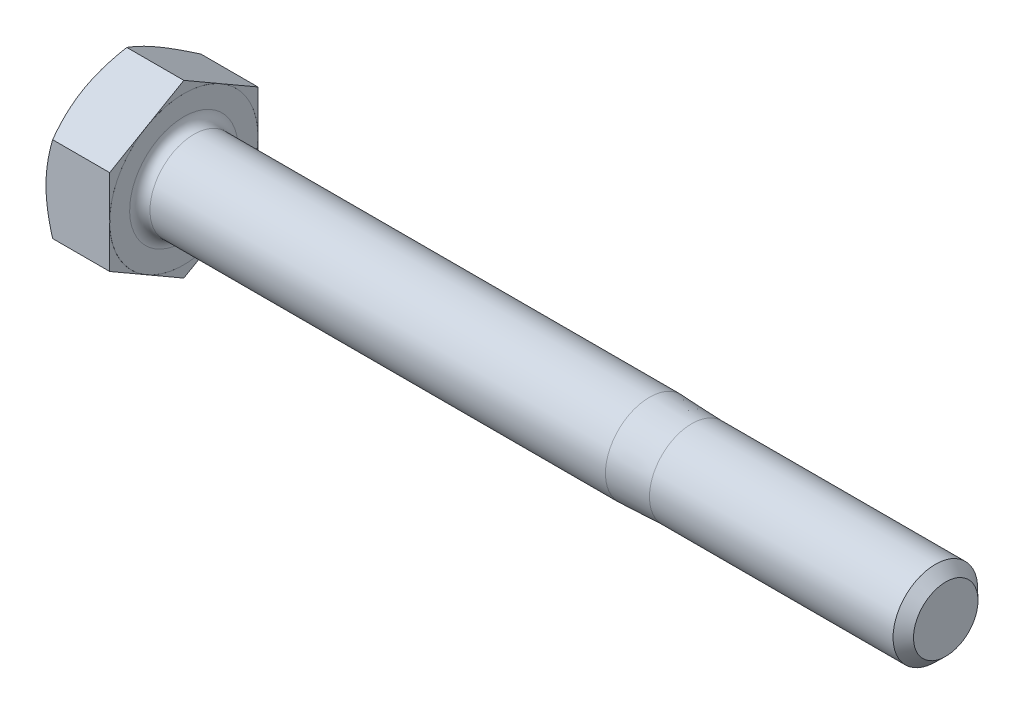
ISO-10303-21;
HEADER;
FILE_DESCRIPTION(('STEP AP214'),'2;1');
FILE_NAME('part.step','',(''),(''),'','','');
FILE_SCHEMA(('AUTOMOTIVE_DESIGN { 1 0 10303 214 1 1 1 1 }'));
ENDSEC;
DATA;
#1=APPLICATION_CONTEXT('core data for automotive mechanical design processes');
#2=APPLICATION_PROTOCOL_DEFINITION('international standard','automotive_design',2000,#1);
#3=PRODUCT_CONTEXT('',#1,'mechanical');
#4=PRODUCT('Part','Part','',(#3));
#5=PRODUCT_RELATED_PRODUCT_CATEGORY('part','',(#4));
#6=PRODUCT_DEFINITION_FORMATION('','',#4);
#7=PRODUCT_DEFINITION_CONTEXT('part definition',#1,'design');
#8=PRODUCT_DEFINITION('design','',#6,#7);
#9=PRODUCT_DEFINITION_SHAPE('','',#8);
#10=(LENGTH_UNIT() NAMED_UNIT(*) SI_UNIT(.MILLI.,.METRE.));
#11=(NAMED_UNIT(*) PLANE_ANGLE_UNIT() SI_UNIT($,.RADIAN.));
#12=(NAMED_UNIT(*) SI_UNIT($,.STERADIAN.) SOLID_ANGLE_UNIT());
#13=UNCERTAINTY_MEASURE_WITH_UNIT(LENGTH_MEASURE(1.E-05),#10,'distance_accuracy_value','');
#14=(GEOMETRIC_REPRESENTATION_CONTEXT(3) GLOBAL_UNCERTAINTY_ASSIGNED_CONTEXT((#13)) GLOBAL_UNIT_ASSIGNED_CONTEXT((#10,
#11,#12)) REPRESENTATION_CONTEXT('',''));
#15=CARTESIAN_POINT('',(0.,0.,0.));
#16=DIRECTION('',(0.,0.,1.));
#17=DIRECTION('',(1.,0.,0.));
#18=AXIS2_PLACEMENT_3D('',#15,#16,#17);
#19=CARTESIAN_POINT('',(-4.77529999999999,3.21156860739421,-5.5626));
#20=DIRECTION('',(0.,-0.866025403784439,0.499999999999999));
#21=DIRECTION('',(0.,-0.499999999999999,-0.866025403784439));
#22=AXIS2_PLACEMENT_3D('',#19,#20,#21);
#23=PLANE('',#22);
#24=CARTESIAN_POINT('',(-4.27840193892987,6.42325268484225,0.000200000000006919));
#25=CARTESIAN_POINT('',(-4.31915379774488,6.3526585812079,-0.122072574209484));
#26=CARTESIAN_POINT('',(-4.35805622469129,6.28180126837449,-0.244801040124756));
#27=CARTESIAN_POINT('',(-4.43165283843947,6.13951120287092,-0.491254662989237));
#28=CARTESIAN_POINT('',(-4.46634520986097,6.06807821602764,-0.614980225538191));
#29=CARTESIAN_POINT('',(-4.56342629893316,5.85263550648139,-0.988137944592613));
#30=CARTESIAN_POINT('',(-4.61864515807664,5.70777535201368,-1.23904309212295));
#31=CARTESIAN_POINT('',(-4.68339621381849,5.49099476252075,-1.61451808721945));
#32=CARTESIAN_POINT('',(-4.70184200165708,5.41972205873199,-1.73796603137439));
#33=CARTESIAN_POINT('',(-4.73277310833255,5.27685459691414,-1.98541973399131));
#34=CARTESIAN_POINT('',(-4.74525895381101,5.20525986790488,-2.10942544218947));
#35=CARTESIAN_POINT('',(-4.76395197006054,5.06194605565757,-2.3576522464282));
#36=CARTESIAN_POINT('',(-4.77016626659417,4.9902272065059,-2.48187293701927));
#37=CARTESIAN_POINT('',(-4.77618959935911,4.84672720555795,-2.73042222954729));
#38=CARTESIAN_POINT('',(-4.77599883344831,4.77494605575469,-2.85475082803224));
#39=CARTESIAN_POINT('',(-4.76667189863659,4.57828637012705,-3.19537539533984));
#40=CARTESIAN_POINT('',(-4.75101260446494,4.4534722013835,-3.41155987710815));
#41=CARTESIAN_POINT('',(-4.70135567661841,4.20467287416473,-3.84249295274001));
#42=CARTESIAN_POINT('',(-4.66734106857655,4.08068859075411,-4.05724003094722));
#43=CARTESIAN_POINT('',(-4.58231395859033,3.83138850679899,-4.48904044268869));
#44=CARTESIAN_POINT('',(-4.53094118606261,3.70610416511176,-4.70603928788378));
#45=CARTESIAN_POINT('',(-4.41434554300041,3.45740388365365,-5.13680081122591));
#46=CARTESIAN_POINT('',(-4.34915006238295,3.33398475856357,-5.35056900650763));
#47=CARTESIAN_POINT('',(-4.27840193892987,3.21145313734037,-5.56279999999999));
#48=B_SPLINE_CURVE_WITH_KNOTS('',3,(#24,#25,#26,#27,#28,#29,#30,#31,#32,#33,#34,#35,#36,#37,#38,
#39,#40,#41,#42,#43,#44,#45,#46,#47),.UNSPECIFIED.,.F.,.F.,(4,2,2,2,2,2,2,2,2,2,2,4),(0.,
0.44082011856227,0.881829648847399,1.76568130465016,2.19678242164486,2.62784543796583,
3.05841812523867,3.48897751176352,4.23854798324166,4.98881282275669,5.75571809391027,
6.52111769989992),.UNSPECIFIED.);
#49=CARTESIAN_POINT('',(-4.27846860739423,6.4231372147884,0.));
#50=VERTEX_POINT('',#49);
#51=CARTESIAN_POINT('',(-4.77530000000001,4.81735291109132,-2.7813));
#52=VERTEX_POINT('',#51);
#53=EDGE_CURVE('E226',#50,#52,#48,.T.);
#54=ORIENTED_EDGE('',*,*,#53,.F.);
#55=DIRECTION('',(1.,0.,0.));
#56=VECTOR('',#55,1.);
#57=CARTESIAN_POINT('',(-4.77529999999999,6.42313721478842,0.));
#58=LINE('',#57,#56);
#59=CARTESIAN_POINT('',(-9.99999999944363E-05,6.42313721478842,0.));
#60=VERTEX_POINT('',#59);
#61=EDGE_CURVE('E149',#50,#60,#58,.T.);
#62=ORIENTED_EDGE('',*,*,#61,.T.);
#63=DIRECTION('',(0.,-0.499999999999999,-0.866025403784439));
#64=VECTOR('',#63,1.);
#65=CARTESIAN_POINT('',(-9.99999999940308E-05,3.21156860739421,-5.5626));
#66=LINE('',#65,#64);
#67=CARTESIAN_POINT('',(-9.99999999942335E-05,4.81735291109131,-2.78129999999999));
#68=VERTEX_POINT('',#67);
#69=EDGE_CURVE('E233',#60,#68,#66,.T.);
#70=ORIENTED_EDGE('',*,*,#69,.T.);
#71=CARTESIAN_POINT('',(-9.99999999940308E-05,3.21156860739421,-5.5626));
#72=VERTEX_POINT('',#71);
#73=EDGE_CURVE('E312',#68,#72,#66,.T.);
#74=ORIENTED_EDGE('',*,*,#73,.T.);
#75=DIRECTION('',(1.,0.,0.));
#76=VECTOR('',#75,1.);
#77=CARTESIAN_POINT('',(-4.77529999999999,3.21156860739421,-5.5626));
#78=LINE('',#77,#76);
#79=CARTESIAN_POINT('',(-4.27846860739423,3.21156860739418,-5.5626));
#80=VERTEX_POINT('',#79);
#81=EDGE_CURVE('E160',#80,#72,#78,.T.);
#82=ORIENTED_EDGE('',*,*,#81,.F.);
#83=EDGE_CURVE('E219',#52,#80,#48,.T.);
#84=ORIENTED_EDGE('',*,*,#83,.F.);
#85=EDGE_LOOP('',(#54,#62,#70,#74,#82,#84));
#86=FACE_BOUND('',#85,.T.);
#87=ADVANCED_FACE('F36',(#86),#23,.F.);
#88=CARTESIAN_POINT('',(-4.77529999999999,-3.21156860739421,-5.5626));
#89=DIRECTION('',(0.,0.,1.));
#90=DIRECTION('',(0.,-1.,0.));
#91=AXIS2_PLACEMENT_3D('',#88,#89,#90);
#92=PLANE('',#91);
#93=CARTESIAN_POINT('',(-2.11344638926698,-8.51755521832246,-5.5626));
#94=CARTESIAN_POINT('',(-2.23147166166824,-8.27332555558046,-5.5626));
#95=CARTESIAN_POINT('',(-2.34832366508809,-8.02851845168018,-5.5626));
#96=CARTESIAN_POINT('',(-2.57901068864596,-7.53743714363392,-5.5626));
#97=CARTESIAN_POINT('',(-2.69284518642687,-7.29116269439858,-5.5626));
#98=CARTESIAN_POINT('',(-2.91742643995797,-6.79550412265191,-5.5626));
#99=CARTESIAN_POINT('',(-3.0281517979358,-6.54611026975771,-5.5626));
#100=CARTESIAN_POINT('',(-3.24484658870404,-6.0452727518282,-5.5626));
#101=CARTESIAN_POINT('',(-3.35081626939904,-5.79382919444944,-5.5626));
#102=CARTESIAN_POINT('',(-3.55799319026707,-5.28537094644158,-5.5626));
#103=CARTESIAN_POINT('',(-3.65912599046174,-5.02832575770978,-5.5626));
#104=CARTESIAN_POINT('',(-3.85347083747971,-4.51120331357714,-5.5626));
#105=CARTESIAN_POINT('',(-3.94668200306209,-4.25112572448762,-5.5626));
#106=CARTESIAN_POINT('',(-4.12267928100746,-3.72805980605447,-5.5626));
#107=CARTESIAN_POINT('',(-4.20548755698438,-3.46507900970405,-5.5626));
#108=CARTESIAN_POINT('',(-4.35798874636038,-2.93537607726828,-5.5626));
#109=CARTESIAN_POINT('',(-4.42768580730656,-2.66865515310524,-5.5626));
#110=CARTESIAN_POINT('',(-4.55058455470475,-2.13130259699166,-5.5626));
#111=CARTESIAN_POINT('',(-4.6037818465973,-1.86066994324131,-5.5626));
#112=CARTESIAN_POINT('',(-4.69008594291753,-1.31610382915986,-5.5626));
#113=CARTESIAN_POINT('',(-4.72319272959575,-1.04217036591281,-5.5626));
#114=CARTESIAN_POINT('',(-4.75566271940497,-0.630834239369238,-5.5626));
#115=CARTESIAN_POINT('',(-4.76362266525993,-0.494075453154336,-5.5626));
#116=CARTESIAN_POINT('',(-4.77374754815026,-0.220337235751522,-5.5626));
#117=CARTESIAN_POINT('',(-4.77591256044099,-0.0833578074520731,-5.5626));
#118=CARTESIAN_POINT('',(-4.77438941878322,0.190528860603805,-5.5626));
#119=CARTESIAN_POINT('',(-4.77070290750695,0.327436109830722,-5.5626));
#120=CARTESIAN_POINT('',(-4.75757014707673,0.600976342858242,-5.5626));
#121=CARTESIAN_POINT('',(-4.74812361028946,0.737609312620523,-5.5626));
#122=CARTESIAN_POINT('',(-4.71844421925849,1.06876539599823,-5.5626));
#123=CARTESIAN_POINT('',(-4.69532516171605,1.26303402663545,-5.5626));
#124=CARTESIAN_POINT('',(-4.63872521450843,1.65008267677664,-5.5626));
#125=CARTESIAN_POINT('',(-4.60524149659494,1.84286227522758,-5.5626));
#126=CARTESIAN_POINT('',(-4.52909973226012,2.22677375324305,-5.5626));
#127=CARTESIAN_POINT('',(-4.48643301145079,2.41790389592351,-5.5626));
#128=CARTESIAN_POINT('',(-4.3932270685715,2.79819772693412,-5.5626));
#129=CARTESIAN_POINT('',(-4.34268858812908,2.98736159872479,-5.5626));
#130=CARTESIAN_POINT('',(-4.23362712743804,3.36838194822663,-5.5626));
#131=CARTESIAN_POINT('',(-4.17493879567645,3.56019076914832,-5.5626));
#132=CARTESIAN_POINT('',(-4.05176338973037,3.94178098716688,-5.5626));
#133=CARTESIAN_POINT('',(-3.98728031517193,4.1315636830324,-5.5626));
#134=CARTESIAN_POINT('',(-3.85384738418795,4.50834012187714,-5.5626));
#135=CARTESIAN_POINT('',(-3.78492471276553,4.69534355027224,-5.56259999999999));
#136=CARTESIAN_POINT('',(-3.64303400403259,5.0678995201045,-5.56259999999999));
#137=CARTESIAN_POINT('',(-3.570064331722,5.25345144007258,-5.56259999999999));
#138=CARTESIAN_POINT('',(-3.49547149678627,5.43832927060622,-5.56259999999999));
#139=B_SPLINE_CURVE_WITH_KNOTS('',3,(#93,#94,#95,#96,#97,#98,#99,#100,#101,#102,#103,#104,#105,
#106,#107,#108,#109,#110,#111,#112,#113,#114,#115,#116,#117,#118,#119,#120,#121,#122,#123,#124,
#125,#126,#127,#128,#129,#130,#131,#132,#133,#134,#135,#136,#137,#138),.UNSPECIFIED.,.F.,.F.,(4,
2,2,2,2,2,2,2,2,2,2,2,2,2,2,2,2,2,2,2,2,2,4),(0.,0.813769390478702,1.6276787437096,
2.44624577284869,3.2647700819345,4.0933433300107,4.92200863225356,5.74887737059678,
6.5754840992548,7.402310798219,8.22913822766265,8.64000464573732,9.0508657281081,9.461611491668,
9.87237776795628,10.4589693289461,11.0457210969488,11.6330295703844,12.2202827447528,
12.8219307649627,13.4231666614523,14.021018397866,14.6191134529125),.UNSPECIFIED.);
#140=CARTESIAN_POINT('',(-4.77530000000001,0.,-5.5626));
#141=VERTEX_POINT('',#140);
#142=EDGE_CURVE('E227',#80,#141,#139,.F.);
#143=ORIENTED_EDGE('',*,*,#142,.F.);
#144=ORIENTED_EDGE('',*,*,#81,.T.);
#145=DIRECTION('',(0.,-1.,0.));
#146=VECTOR('',#145,1.);
#147=CARTESIAN_POINT('',(-9.99999999932197E-05,-3.21156860739421,-5.5626));
#148=LINE('',#147,#146);
#149=CARTESIAN_POINT('',(-9.99999999936252E-05,0.,-5.5626));
#150=VERTEX_POINT('',#149);
#151=EDGE_CURVE('E315',#72,#150,#148,.T.);
#152=ORIENTED_EDGE('',*,*,#151,.T.);
#153=CARTESIAN_POINT('',(-9.99999999932197E-05,-3.21156860739421,-5.5626));
#154=VERTEX_POINT('',#153);
#155=EDGE_CURVE('E317',#150,#154,#148,.T.);
#156=ORIENTED_EDGE('',*,*,#155,.T.);
#157=DIRECTION('',(1.,0.,0.));
#158=VECTOR('',#157,1.);
#159=CARTESIAN_POINT('',(-4.77529999999999,-3.21156860739421,-5.5626));
#160=LINE('',#159,#158);
#161=CARTESIAN_POINT('',(-4.27846860739423,-3.21156860739422,-5.56259999999997));
#162=VERTEX_POINT('',#161);
#163=EDGE_CURVE('E158',#162,#154,#160,.T.);
#164=ORIENTED_EDGE('',*,*,#163,.F.);
#165=EDGE_CURVE('E228',#141,#162,#139,.F.);
#166=ORIENTED_EDGE('',*,*,#165,.F.);
#167=EDGE_LOOP('',(#143,#144,#152,#156,#164,#166));
#168=FACE_BOUND('',#167,.T.);
#169=ADVANCED_FACE('F202',(#168),#92,.F.);
#170=CARTESIAN_POINT('',(-4.77529999999999,-6.42313721478842,0.));
#171=DIRECTION('',(0.,0.866025403784438,0.5));
#172=DIRECTION('',(0.,-0.500000000000001,0.866025403784438));
#173=AXIS2_PLACEMENT_3D('',#170,#171,#172);
#174=PLANE('',#173);
#175=CARTESIAN_POINT('',(-4.27840193892987,-3.21145313734037,-5.5628));
#176=CARTESIAN_POINT('',(-4.31915379774488,-3.28204724097473,-5.44052742579051));
#177=CARTESIAN_POINT('',(-4.35805622469129,-3.35290455380814,-5.31779895987524));
#178=CARTESIAN_POINT('',(-4.43165283843947,-3.49519461931171,-5.07134533701075));
#179=CARTESIAN_POINT('',(-4.46634520986097,-3.56662760615498,-4.9476197744618));
#180=CARTESIAN_POINT('',(-4.56342629893316,-3.78207031570124,-4.57446205540738));
#181=CARTESIAN_POINT('',(-4.61864515807664,-3.92693047016895,-4.32355690787704));
#182=CARTESIAN_POINT('',(-4.68339621381848,-4.14371105966188,-3.94808191278054));
#183=CARTESIAN_POINT('',(-4.70184200165708,-4.21498376345064,-3.8246339686256));
#184=CARTESIAN_POINT('',(-4.73277310833255,-4.35785122526849,-3.57718026600868));
#185=CARTESIAN_POINT('',(-4.745258953811,-4.42944595427775,-3.45317455781052));
#186=CARTESIAN_POINT('',(-4.76395197006054,-4.57275976652506,-3.20494775357179));
#187=CARTESIAN_POINT('',(-4.77016626659416,-4.64447861567673,-3.08072706298072));
#188=CARTESIAN_POINT('',(-4.77618959935911,-4.78797861662468,-2.8321777704527));
#189=CARTESIAN_POINT('',(-4.77599883344831,-4.85975976642794,-2.70784917196775));
#190=CARTESIAN_POINT('',(-4.76667189863659,-5.05641945205558,-2.36722460466015));
#191=CARTESIAN_POINT('',(-4.75101260446493,-5.18123362079913,-2.15104012289184));
#192=CARTESIAN_POINT('',(-4.7013556766184,-5.4300329480179,-1.72010704725999));
#193=CARTESIAN_POINT('',(-4.66734106857655,-5.55401723142852,-1.50535996905277));
#194=CARTESIAN_POINT('',(-4.58231395859033,-5.80331731538365,-1.07355955731131));
#195=CARTESIAN_POINT('',(-4.53094118606261,-5.92860165707087,-0.856560712116215));
#196=CARTESIAN_POINT('',(-4.41434554300041,-6.17730193852898,-0.425799188774088));
#197=CARTESIAN_POINT('',(-4.34915006238295,-6.30072106361906,-0.212030993492368));
#198=CARTESIAN_POINT('',(-4.27840193892987,-6.42325268484226,0.000199999999995457));
#199=B_SPLINE_CURVE_WITH_KNOTS('',3,(#175,#176,#177,#178,#179,#180,#181,#182,#183,#184,#185,
#186,#187,#188,#189,#190,#191,#192,#193,#194,#195,#196,#197,#198),.UNSPECIFIED.,.F.,.F.,(4,2,2,
2,2,2,2,2,2,2,2,4),(0.,0.440820118562269,0.881829648847399,1.76568130465016,2.19678242164486,
2.62784543796583,3.05841812523868,3.48897751176353,4.23854798324166,4.98881282275669,
5.75571809391026,6.52111769989991),.UNSPECIFIED.);
#200=CARTESIAN_POINT('',(-4.77530000000001,-4.81735291109132,-2.7813));
#201=VERTEX_POINT('',#200);
#202=EDGE_CURVE('E267',#162,#201,#199,.T.);
#203=ORIENTED_EDGE('',*,*,#202,.F.);
#204=ORIENTED_EDGE('',*,*,#163,.T.);
#205=DIRECTION('',(0.,-0.5,0.866025403784438));
#206=VECTOR('',#205,1.);
#207=CARTESIAN_POINT('',(-9.99999999928142E-05,-6.42313721478842,0.));
#208=LINE('',#207,#206);
#209=CARTESIAN_POINT('',(-9.99999999930169E-05,-4.81735291109131,-2.7813));
#210=VERTEX_POINT('',#209);
#211=EDGE_CURVE('E335',#154,#210,#208,.T.);
#212=ORIENTED_EDGE('',*,*,#211,.T.);
#213=CARTESIAN_POINT('',(-9.99999999928142E-05,-6.42313721478842,0.));
#214=VERTEX_POINT('',#213);
#215=EDGE_CURVE('E337',#210,#214,#208,.T.);
#216=ORIENTED_EDGE('',*,*,#215,.T.);
#217=DIRECTION('',(1.,0.,0.));
#218=VECTOR('',#217,1.);
#219=CARTESIAN_POINT('',(-4.77529999999999,-6.42313721478842,0.));
#220=LINE('',#219,#218);
#221=CARTESIAN_POINT('',(-4.27846860739423,-6.4231372147884,0.));
#222=VERTEX_POINT('',#221);
#223=EDGE_CURVE('E151',#222,#214,#220,.T.);
#224=ORIENTED_EDGE('',*,*,#223,.F.);
#225=EDGE_CURVE('E263',#201,#222,#199,.T.);
#226=ORIENTED_EDGE('',*,*,#225,.F.);
#227=EDGE_LOOP('',(#203,#204,#212,#216,#224,#226));
#228=FACE_BOUND('',#227,.T.);
#229=ADVANCED_FACE('F208',(#228),#174,.F.);
#230=CARTESIAN_POINT('',(-4.77529999999999,-3.21156860739421,5.56259999999999));
#231=DIRECTION('',(0.,0.866025403784439,-0.5));
#232=DIRECTION('',(0.,0.5,0.866025403784439));
#233=AXIS2_PLACEMENT_3D('',#230,#231,#232);
#234=PLANE('',#233);
#235=CARTESIAN_POINT('',(-4.27840193892987,-6.42325268484226,-0.000200000000004441));
#236=CARTESIAN_POINT('',(-4.31915379774488,-6.3526585812079,0.122072574209487));
#237=CARTESIAN_POINT('',(-4.35805622469129,-6.28180126837449,0.244801040124758));
#238=CARTESIAN_POINT('',(-4.43165283843947,-6.13951120287092,0.491254662989239));
#239=CARTESIAN_POINT('',(-4.46634520986097,-6.06807821602765,0.614980225538193));
#240=CARTESIAN_POINT('',(-4.56342629893316,-5.85263550648139,0.988137944592616));
#241=CARTESIAN_POINT('',(-4.61864515807664,-5.70777535201368,1.23904309212296));
#242=CARTESIAN_POINT('',(-4.68339621381848,-5.49099476252075,1.61451808721945));
#243=CARTESIAN_POINT('',(-4.70184200165708,-5.41972205873199,1.73796603137439));
#244=CARTESIAN_POINT('',(-4.73277310833255,-5.27685459691414,1.98541973399132));
#245=CARTESIAN_POINT('',(-4.74525895381101,-5.20525986790488,2.10942544218948));
#246=CARTESIAN_POINT('',(-4.76395197006054,-5.06194605565757,2.35765224642821));
#247=CARTESIAN_POINT('',(-4.77016626659416,-4.9902272065059,2.48187293701927));
#248=CARTESIAN_POINT('',(-4.77618959935911,-4.84672720555795,2.7304222295473));
#249=CARTESIAN_POINT('',(-4.77599883344831,-4.77494605575469,2.85475082803225));
#250=CARTESIAN_POINT('',(-4.76667189863659,-4.57828637012705,3.19537539533984));
#251=CARTESIAN_POINT('',(-4.75101260446493,-4.4534722013835,3.41155987710816));
#252=CARTESIAN_POINT('',(-4.7013556766184,-4.20467287416474,3.84249295274001));
#253=CARTESIAN_POINT('',(-4.66734106857655,-4.08068859075412,4.05724003094722));
#254=CARTESIAN_POINT('',(-4.58231395859033,-3.83138850679899,4.48904044268869));
#255=CARTESIAN_POINT('',(-4.53094118606261,-3.70610416511176,4.70603928788378));
#256=CARTESIAN_POINT('',(-4.41434554300041,-3.45740388365365,5.13680081122591));
#257=CARTESIAN_POINT('',(-4.34915006238295,-3.33398475856357,5.35056900650763));
#258=CARTESIAN_POINT('',(-4.27840193892987,-3.21145313734038,5.56279999999999));
#259=B_SPLINE_CURVE_WITH_KNOTS('',3,(#235,#236,#237,#238,#239,#240,#241,#242,#243,#244,#245,
#246,#247,#248,#249,#250,#251,#252,#253,#254,#255,#256,#257,#258),.UNSPECIFIED.,.F.,.F.,(4,2,2,
2,2,2,2,2,2,2,2,4),(0.,0.44082011856227,0.881829648847398,1.76568130465016,2.19678242164486,
2.62784543796583,3.05841812523868,3.48897751176352,4.23854798324166,4.98881282275669,
5.75571809391027,6.52111769989991),.UNSPECIFIED.);
#260=CARTESIAN_POINT('',(-4.77530000000001,-4.81735291109132,2.7813));
#261=VERTEX_POINT('',#260);
#262=EDGE_CURVE('E59',#222,#261,#259,.T.);
#263=ORIENTED_EDGE('',*,*,#262,.F.);
#264=ORIENTED_EDGE('',*,*,#223,.T.);
#265=DIRECTION('',(0.,0.5,0.866025403784439));
#266=VECTOR('',#265,1.);
#267=CARTESIAN_POINT('',(-9.99999999932197E-05,-3.21156860739421,5.56259999999999));
#268=LINE('',#267,#266);
#269=CARTESIAN_POINT('',(-9.99999999930169E-05,-4.81735291109132,2.78129999999999));
#270=VERTEX_POINT('',#269);
#271=EDGE_CURVE('E330',#214,#270,#268,.T.);
#272=ORIENTED_EDGE('',*,*,#271,.T.);
#273=CARTESIAN_POINT('',(-9.99999999932197E-05,-3.21156860739421,5.56259999999999));
#274=VERTEX_POINT('',#273);
#275=EDGE_CURVE('E328',#270,#274,#268,.T.);
#276=ORIENTED_EDGE('',*,*,#275,.T.);
#277=DIRECTION('',(1.,0.,0.));
#278=VECTOR('',#277,1.);
#279=CARTESIAN_POINT('',(-4.77529999999999,-3.21156860739421,5.56259999999999));
#280=LINE('',#279,#278);
#281=CARTESIAN_POINT('',(-4.27846860739423,-3.21156860739418,5.56259999999999));
#282=VERTEX_POINT('',#281);
#283=EDGE_CURVE('E148',#282,#274,#280,.T.);
#284=ORIENTED_EDGE('',*,*,#283,.F.);
#285=EDGE_CURVE('E258',#261,#282,#259,.T.);
#286=ORIENTED_EDGE('',*,*,#285,.F.);
#287=EDGE_LOOP('',(#263,#264,#272,#276,#284,#286));
#288=FACE_BOUND('',#287,.T.);
#289=ADVANCED_FACE('F270',(#288),#234,.F.);
#290=CARTESIAN_POINT('',(-4.77529999999999,3.2115686073942,5.5626));
#291=DIRECTION('',(0.,0.,-1.));
#292=DIRECTION('',(0.,1.,0.));
#293=AXIS2_PLACEMENT_3D('',#290,#291,#292);
#294=PLANE('',#293);
#295=CARTESIAN_POINT('',(-2.11344638926698,-8.51755521832247,5.56259999999999));
#296=CARTESIAN_POINT('',(-2.23147166166824,-8.27332555558047,5.56259999999999));
#297=CARTESIAN_POINT('',(-2.3483236650881,-8.02851845168018,5.56259999999999));
#298=CARTESIAN_POINT('',(-2.57901068864596,-7.53743714363393,5.56259999999999));
#299=CARTESIAN_POINT('',(-2.69284518642687,-7.29116269439858,5.56259999999999));
#300=CARTESIAN_POINT('',(-2.91742643995797,-6.79550412265191,5.56259999999999));
#301=CARTESIAN_POINT('',(-3.0281517979358,-6.54611026975771,5.56259999999999));
#302=CARTESIAN_POINT('',(-3.24484658870404,-6.0452727518282,5.56259999999999));
#303=CARTESIAN_POINT('',(-3.35081626939904,-5.79382919444945,5.56259999999999));
#304=CARTESIAN_POINT('',(-3.55799319026707,-5.28537094644159,5.56259999999999));
#305=CARTESIAN_POINT('',(-3.65912599046174,-5.02832575770978,5.56259999999999));
#306=CARTESIAN_POINT('',(-3.85347083747971,-4.51120331357715,5.56259999999999));
#307=CARTESIAN_POINT('',(-3.94668200306209,-4.25112572448762,5.56259999999999));
#308=CARTESIAN_POINT('',(-4.12267928100746,-3.72805980605448,5.56259999999999));
#309=CARTESIAN_POINT('',(-4.20548755698438,-3.46507900970406,5.56259999999999));
#310=CARTESIAN_POINT('',(-4.35798874636038,-2.93537607726828,5.56259999999999));
#311=CARTESIAN_POINT('',(-4.42768580730656,-2.66865515310525,5.56259999999999));
#312=CARTESIAN_POINT('',(-4.55058455470475,-2.13130259699167,5.56259999999999));
#313=CARTESIAN_POINT('',(-4.6037818465973,-1.86066994324131,5.56259999999999));
#314=CARTESIAN_POINT('',(-4.69008594291753,-1.31610382915987,5.56259999999999));
#315=CARTESIAN_POINT('',(-4.72319272959575,-1.04217036591282,5.56259999999999));
#316=CARTESIAN_POINT('',(-4.75566271940497,-0.630834239369243,5.56259999999999));
#317=CARTESIAN_POINT('',(-4.76362266525993,-0.494075453154342,5.56259999999999));
#318=CARTESIAN_POINT('',(-4.77374754815026,-0.220337235751528,5.56259999999999));
#319=CARTESIAN_POINT('',(-4.77591256044099,-0.0833578074520796,5.56259999999999));
#320=CARTESIAN_POINT('',(-4.77438941878322,0.190528860603799,5.56259999999999));
#321=CARTESIAN_POINT('',(-4.77070290750695,0.327436109830716,5.56259999999999));
#322=CARTESIAN_POINT('',(-4.75757014707673,0.600976342858236,5.56259999999999));
#323=CARTESIAN_POINT('',(-4.74812361028946,0.737609312620516,5.5626));
#324=CARTESIAN_POINT('',(-4.71844421925849,1.06876539599822,5.5626));
#325=CARTESIAN_POINT('',(-4.69532516171605,1.26303402663544,5.5626));
#326=CARTESIAN_POINT('',(-4.63872521450843,1.65008267677663,5.5626));
#327=CARTESIAN_POINT('',(-4.60524149659494,1.84286227522757,5.5626));
#328=CARTESIAN_POINT('',(-4.52909973226012,2.22677375324304,5.5626));
#329=CARTESIAN_POINT('',(-4.48643301145079,2.4179038959235,5.5626));
#330=CARTESIAN_POINT('',(-4.3932270685715,2.79819772693411,5.5626));
#331=CARTESIAN_POINT('',(-4.34268858812908,2.98736159872479,5.5626));
#332=CARTESIAN_POINT('',(-4.23362712743804,3.36838194822662,5.5626));
#333=CARTESIAN_POINT('',(-4.17493879567645,3.56019076914831,5.5626));
#334=CARTESIAN_POINT('',(-4.05176338973038,3.94178098716687,5.5626));
#335=CARTESIAN_POINT('',(-3.98728031517193,4.13156368303239,5.5626));
#336=CARTESIAN_POINT('',(-3.85384738418795,4.50834012187714,5.5626));
#337=CARTESIAN_POINT('',(-3.78492471276553,4.69534355027224,5.5626));
#338=CARTESIAN_POINT('',(-3.64303400403259,5.0678995201045,5.5626));
#339=CARTESIAN_POINT('',(-3.570064331722,5.25345144007257,5.5626));
#340=CARTESIAN_POINT('',(-3.49547149678627,5.43832927060621,5.5626));
#341=B_SPLINE_CURVE_WITH_KNOTS('',3,(#295,#296,#297,#298,#299,#300,#301,#302,#303,#304,#305,
#306,#307,#308,#309,#310,#311,#312,#313,#314,#315,#316,#317,#318,#319,#320,#321,#322,#323,#324,
#325,#326,#327,#328,#329,#330,#331,#332,#333,#334,#335,#336,#337,#338,#339,#340),.UNSPECIFIED.,
.F.,.F.,(4,2,2,2,2,2,2,2,2,2,2,2,2,2,2,2,2,2,2,2,2,2,4),(0.,0.813769390478702,1.6276787437096,
2.44624577284869,3.2647700819345,4.0933433300107,4.92200863225356,5.74887737059678,
6.57548409925479,7.402310798219,8.22913822766265,8.64000464573732,9.05086572810809,
9.461611491668,9.87237776795628,10.4589693289461,11.0457210969488,11.6330295703844,
12.2202827447528,12.8219307649627,13.4231666614523,14.021018397866,14.6191134529125),.UNSPECIFIED.);
#342=CARTESIAN_POINT('',(-4.77530000000001,0.,5.5626));
#343=VERTEX_POINT('',#342);
#344=EDGE_CURVE('E51',#282,#343,#341,.T.);
#345=ORIENTED_EDGE('',*,*,#344,.F.);
#346=ORIENTED_EDGE('',*,*,#283,.T.);
#347=DIRECTION('',(0.,1.,0.));
#348=VECTOR('',#347,1.);
#349=CARTESIAN_POINT('',(-9.99999999940308E-05,3.2115686073942,5.5626));
#350=LINE('',#349,#348);
#351=CARTESIAN_POINT('',(-9.99999999936252E-05,0.,5.56259999999999));
#352=VERTEX_POINT('',#351);
#353=EDGE_CURVE('E326',#274,#352,#350,.T.);
#354=ORIENTED_EDGE('',*,*,#353,.T.);
#355=CARTESIAN_POINT('',(-9.99999999940308E-05,3.2115686073942,5.5626));
#356=VERTEX_POINT('',#355);
#357=EDGE_CURVE('E146',#352,#356,#350,.T.);
#358=ORIENTED_EDGE('',*,*,#357,.T.);
#359=DIRECTION('',(1.,0.,0.));
#360=VECTOR('',#359,1.);
#361=CARTESIAN_POINT('',(-4.77529999999999,3.2115686073942,5.5626));
#362=LINE('',#361,#360);
#363=CARTESIAN_POINT('',(-4.27846860739423,3.21156860739422,5.56259999999997));
#364=VERTEX_POINT('',#363);
#365=EDGE_CURVE('E138',#364,#356,#362,.T.);
#366=ORIENTED_EDGE('',*,*,#365,.F.);
#367=EDGE_CURVE('E126',#343,#364,#341,.T.);
#368=ORIENTED_EDGE('',*,*,#367,.F.);
#369=EDGE_LOOP('',(#345,#346,#354,#358,#366,#368));
#370=FACE_BOUND('',#369,.T.);
#371=ADVANCED_FACE('F143',(#370),#294,.F.);
#372=CARTESIAN_POINT('',(-4.77529999999999,6.42313721478842,0.));
#373=DIRECTION('',(0.,-0.866025403784438,-0.500000000000001));
#374=DIRECTION('',(0.,0.500000000000001,-0.866025403784438));
#375=AXIS2_PLACEMENT_3D('',#372,#373,#374);
#376=PLANE('',#375);
#377=CARTESIAN_POINT('',(-4.27840193892987,3.21145313734037,5.5628));
#378=CARTESIAN_POINT('',(-4.31915379774488,3.28204724097472,5.44052742579051));
#379=CARTESIAN_POINT('',(-4.35805622469129,3.35290455380814,5.31779895987524));
#380=CARTESIAN_POINT('',(-4.43165283843947,3.4951946193117,5.07134533701075));
#381=CARTESIAN_POINT('',(-4.46634520986097,3.56662760615498,4.9476197744618));
#382=CARTESIAN_POINT('',(-4.56342629893316,3.78207031570124,4.57446205540738));
#383=CARTESIAN_POINT('',(-4.61864515807664,3.92693047016894,4.32355690787704));
#384=CARTESIAN_POINT('',(-4.68339621381849,4.14371105966188,3.94808191278054));
#385=CARTESIAN_POINT('',(-4.70184200165708,4.21498376345064,3.8246339686256));
#386=CARTESIAN_POINT('',(-4.73277310833255,4.35785122526849,3.57718026600868));
#387=CARTESIAN_POINT('',(-4.74525895381101,4.42944595427775,3.45317455781052));
#388=CARTESIAN_POINT('',(-4.76395197006054,4.57275976652506,3.20494775357179));
#389=CARTESIAN_POINT('',(-4.77016626659417,4.64447861567673,3.08072706298072));
#390=CARTESIAN_POINT('',(-4.77618959935911,4.78797861662468,2.8321777704527));
#391=CARTESIAN_POINT('',(-4.77599883344831,4.85975976642793,2.70784917196775));
#392=CARTESIAN_POINT('',(-4.76667189863659,5.05641945205557,2.36722460466015));
#393=CARTESIAN_POINT('',(-4.75101260446494,5.18123362079913,2.15104012289184));
#394=CARTESIAN_POINT('',(-4.70135567661841,5.43003294801789,1.72010704725999));
#395=CARTESIAN_POINT('',(-4.66734106857655,5.55401723142851,1.50535996905278));
#396=CARTESIAN_POINT('',(-4.58231395859033,5.80331731538364,1.07355955731131));
#397=CARTESIAN_POINT('',(-4.53094118606261,5.92860165707086,0.856560712116217));
#398=CARTESIAN_POINT('',(-4.41434554300042,6.17730193852898,0.425799188774089));
#399=CARTESIAN_POINT('',(-4.34915006238295,6.30072106361906,0.212030993492369));
#400=CARTESIAN_POINT('',(-4.27840193892987,6.42325268484225,-0.000199999999993345));
#401=B_SPLINE_CURVE_WITH_KNOTS('',3,(#377,#378,#379,#380,#381,#382,#383,#384,#385,#386,#387,
#388,#389,#390,#391,#392,#393,#394,#395,#396,#397,#398,#399,#400),.UNSPECIFIED.,.F.,.F.,(4,2,2,
2,2,2,2,2,2,2,2,4),(0.,0.44082011856227,0.881829648847399,1.76568130465016,2.19678242164486,
2.62784543796583,3.05841812523867,3.48897751176352,4.23854798324166,4.98881282275669,
5.75571809391026,6.52111769989991),.UNSPECIFIED.);
#402=CARTESIAN_POINT('',(-4.77529999999999,4.81735291109131,2.7813));
#403=VERTEX_POINT('',#402);
#404=EDGE_CURVE('E129',#364,#403,#401,.T.);
#405=ORIENTED_EDGE('',*,*,#404,.F.);
#406=ORIENTED_EDGE('',*,*,#365,.T.);
#407=DIRECTION('',(0.,0.500000000000001,-0.866025403784438));
#408=VECTOR('',#407,1.);
#409=CARTESIAN_POINT('',(-9.99999999944363E-05,6.42313721478842,0.));
#410=LINE('',#409,#408);
#411=CARTESIAN_POINT('',(-9.9999999996545E-05,4.81735291109131,2.7813));
#412=VERTEX_POINT('',#411);
#413=EDGE_CURVE('E153',#356,#412,#410,.T.);
#414=ORIENTED_EDGE('',*,*,#413,.T.);
#415=EDGE_CURVE('E307',#412,#60,#410,.T.);
#416=ORIENTED_EDGE('',*,*,#415,.T.);
#417=ORIENTED_EDGE('',*,*,#61,.F.);
#418=EDGE_CURVE('E141',#403,#50,#401,.T.);
#419=ORIENTED_EDGE('',*,*,#418,.F.);
#420=EDGE_LOOP('',(#405,#406,#414,#416,#417,#419));
#421=FACE_BOUND('',#420,.T.);
#422=ADVANCED_FACE('F137',(#421),#376,.F.);
#423=CARTESIAN_POINT('',(57.15,0.,0.));
#424=DIRECTION('',(1.,0.,0.));
#425=DIRECTION('',(0.,1.,0.));
#426=AXIS2_PLACEMENT_3D('',#423,#424,#425);
#427=PLANE('',#426);
#428=CARTESIAN_POINT('',(57.15,0.,0.));
#429=DIRECTION('',(1.,0.,0.));
#430=DIRECTION('',(0.,1.,0.));
#431=AXIS2_PLACEMENT_3D('',#428,#429,#430);
#432=CIRCLE('',#431,2.41925000000001);
#433=CARTESIAN_POINT('',(57.15,2.41925000000002,0.));
#434=VERTEX_POINT('',#433);
#435=EDGE_CURVE('E181',#434,#434,#432,.T.);
#436=ORIENTED_EDGE('',*,*,#435,.T.);
#437=EDGE_LOOP('',(#436));
#438=FACE_BOUND('',#437,.T.);
#439=ADVANCED_FACE('F279',(#438),#427,.T.);
#440=CARTESIAN_POINT('',(57.15,0.,0.));
#441=DIRECTION('',(1.,0.,0.));
#442=DIRECTION('',(0.,1.,0.));
#443=AXIS2_PLACEMENT_3D('',#440,#441,#442);
#444=CYLINDRICAL_SURFACE('',#443,3.175);
#445=CARTESIAN_POINT('',(56.3709185,0.,0.));
#446=DIRECTION('',(1.,0.,0.));
#447=DIRECTION('',(0.,1.,0.));
#448=AXIS2_PLACEMENT_3D('',#445,#446,#447);
#449=CIRCLE('',#448,3.175);
#450=CARTESIAN_POINT('',(56.3709185,3.17500000000001,0.));
#451=VERTEX_POINT('',#450);
#452=EDGE_CURVE('E184',#451,#451,#449,.F.);
#453=ORIENTED_EDGE('',*,*,#452,.T.);
#454=EDGE_LOOP('',(#453));
#455=FACE_BOUND('',#454,.T.);
#456=CARTESIAN_POINT('',(38.1,0.,0.));
#457=DIRECTION('',(1.,0.,0.));
#458=DIRECTION('',(0.,1.,0.));
#459=AXIS2_PLACEMENT_3D('',#456,#457,#458);
#460=CIRCLE('',#459,3.175);
#461=CARTESIAN_POINT('',(38.1,3.17500000000001,0.));
#462=VERTEX_POINT('',#461);
#463=EDGE_CURVE('E173',#462,#462,#460,.T.);
#464=ORIENTED_EDGE('',*,*,#463,.T.);
#465=EDGE_LOOP('',(#464));
#466=FACE_BOUND('',#465,.T.);
#467=ADVANCED_FACE('F473',(#455,#466),#444,.T.);
#468=CARTESIAN_POINT('',(38.1,0.,0.));
#469=DIRECTION('',(-1.,0.,0.));
#470=DIRECTION('',(0.,-1.,0.));
#471=AXIS2_PLACEMENT_3D('',#468,#469,#470);
#472=CONICAL_SURFACE('',#471,3.175,0.039977429332851);
#473=CARTESIAN_POINT('',(34.9249,0.,0.));
#474=DIRECTION('',(1.,0.,0.));
#475=DIRECTION('',(0.,1.,0.));
#476=AXIS2_PLACEMENT_3D('',#473,#474,#475);
#477=CIRCLE('',#476,3.302);
#478=CARTESIAN_POINT('',(34.9249,3.30200000000001,0.));
#479=VERTEX_POINT('',#478);
#480=EDGE_CURVE('E170',#479,#479,#477,.T.);
#481=ORIENTED_EDGE('',*,*,#480,.T.);
#482=EDGE_LOOP('',(#481));
#483=FACE_BOUND('',#482,.T.);
#484=ORIENTED_EDGE('',*,*,#463,.F.);
#485=EDGE_LOOP('',(#484));
#486=FACE_BOUND('',#485,.T.);
#487=ADVANCED_FACE('F485',(#483,#486),#472,.T.);
#488=CARTESIAN_POINT('',(57.15,0.,0.));
#489=DIRECTION('',(1.,0.,0.));
#490=DIRECTION('',(0.,1.,0.));
#491=AXIS2_PLACEMENT_3D('',#488,#489,#490);
#492=CYLINDRICAL_SURFACE('',#491,3.302);
#493=CARTESIAN_POINT('',(0.762000000000006,0.,0.));
#494=DIRECTION('',(1.,0.,0.));
#495=DIRECTION('',(0.,1.,0.));
#496=AXIS2_PLACEMENT_3D('',#493,#494,#495);
#497=CIRCLE('',#496,3.302);
#498=CARTESIAN_POINT('',(0.762000000000005,3.302,0.));
#499=VERTEX_POINT('',#498);
#500=EDGE_CURVE('E44',#499,#499,#497,.T.);
#501=ORIENTED_EDGE('',*,*,#500,.T.);
#502=EDGE_LOOP('',(#501));
#503=FACE_BOUND('',#502,.T.);
#504=ORIENTED_EDGE('',*,*,#480,.F.);
#505=EDGE_LOOP('',(#504));
#506=FACE_BOUND('',#505,.T.);
#507=ADVANCED_FACE('F189',(#503,#506),#492,.T.);
#508=CARTESIAN_POINT('',(0.,3.302,0.));
#509=DIRECTION('',(1.,0.,0.));
#510=DIRECTION('',(0.,1.,0.));
#511=AXIS2_PLACEMENT_3D('',#508,#509,#510);
#512=PLANE('',#511);
#513=CARTESIAN_POINT('',(0.,0.,0.));
#514=DIRECTION('',(1.,0.,0.));
#515=DIRECTION('',(0.,1.,0.));
#516=AXIS2_PLACEMENT_3D('',#513,#514,#515);
#517=CIRCLE('',#516,4.064);
#518=CARTESIAN_POINT('',(0.,4.064,0.));
#519=VERTEX_POINT('',#518);
#520=EDGE_CURVE('E11',#519,#519,#517,.F.);
#521=ORIENTED_EDGE('',*,*,#520,.T.);
#522=EDGE_LOOP('',(#521));
#523=FACE_BOUND('',#522,.T.);
#524=CARTESIAN_POINT('',(0.,0.,0.));
#525=DIRECTION('',(1.,0.,0.));
#526=DIRECTION('',(0.,1.,0.));
#527=AXIS2_PLACEMENT_3D('',#524,#525,#526);
#528=CIRCLE('',#527,5.5626);
#529=CARTESIAN_POINT('',(0.,5.5626,0.));
#530=VERTEX_POINT('',#529);
#531=EDGE_CURVE('E166',#530,#530,#528,.T.);
#532=ORIENTED_EDGE('',*,*,#531,.T.);
#533=EDGE_LOOP('',(#532));
#534=FACE_BOUND('',#533,.T.);
#535=ADVANCED_FACE('F290',(#523,#534),#512,.T.);
#536=CARTESIAN_POINT('',(57.15,0.,0.));
#537=DIRECTION('',(1.,0.,0.));
#538=DIRECTION('',(0.,1.,0.));
#539=AXIS2_PLACEMENT_3D('',#536,#537,#538);
#540=CYLINDRICAL_SURFACE('',#539,5.5626);
#541=CARTESIAN_POINT('',(-9.99999999959367E-05,0.,0.));
#542=DIRECTION('',(1.,0.,0.));
#543=DIRECTION('',(0.,1.,0.));
#544=AXIS2_PLACEMENT_3D('',#541,#542,#543);
#545=CIRCLE('',#544,5.5626);
#546=EDGE_CURVE('E163',#412,#352,#545,.T.);
#547=ORIENTED_EDGE('',*,*,#546,.T.);
#548=EDGE_CURVE('E167',#352,#270,#545,.T.);
#549=ORIENTED_EDGE('',*,*,#548,.T.);
#550=EDGE_CURVE('E322',#270,#210,#545,.T.);
#551=ORIENTED_EDGE('',*,*,#550,.T.);
#552=EDGE_CURVE('E321',#210,#150,#545,.T.);
#553=ORIENTED_EDGE('',*,*,#552,.T.);
#554=EDGE_CURVE('E309',#150,#68,#545,.T.);
#555=ORIENTED_EDGE('',*,*,#554,.T.);
#556=EDGE_CURVE('E162',#68,#412,#545,.T.);
#557=ORIENTED_EDGE('',*,*,#556,.T.);
#558=EDGE_LOOP('',(#547,#549,#551,#553,#555,#557));
#559=FACE_BOUND('',#558,.T.);
#560=ORIENTED_EDGE('',*,*,#531,.F.);
#561=EDGE_LOOP('',(#560));
#562=FACE_BOUND('',#561,.T.);
#563=ADVANCED_FACE('F216',(#559,#562),#540,.T.);
#564=CARTESIAN_POINT('',(-9.99999999936252E-05,0.,0.));
#565=DIRECTION('',(1.,0.,0.));
#566=DIRECTION('',(0.,1.,0.));
#567=AXIS2_PLACEMENT_3D('',#564,#565,#566);
#568=PLANE('',#567);
#569=ORIENTED_EDGE('',*,*,#546,.F.);
#570=ORIENTED_EDGE('',*,*,#413,.F.);
#571=ORIENTED_EDGE('',*,*,#357,.F.);
#572=EDGE_LOOP('',(#569,#570,#571));
#573=FACE_BOUND('',#572,.T.);
#574=ADVANCED_FACE('F280',(#573),#568,.T.);
#575=ORIENTED_EDGE('',*,*,#548,.F.);
#576=ORIENTED_EDGE('',*,*,#353,.F.);
#577=ORIENTED_EDGE('',*,*,#275,.F.);
#578=EDGE_LOOP('',(#575,#576,#577));
#579=FACE_BOUND('',#578,.T.);
#580=ADVANCED_FACE('F282',(#579),#568,.T.);
#581=ORIENTED_EDGE('',*,*,#550,.F.);
#582=ORIENTED_EDGE('',*,*,#271,.F.);
#583=ORIENTED_EDGE('',*,*,#215,.F.);
#584=EDGE_LOOP('',(#581,#582,#583));
#585=FACE_BOUND('',#584,.T.);
#586=ADVANCED_FACE('F288',(#585),#568,.T.);
#587=ORIENTED_EDGE('',*,*,#552,.F.);
#588=ORIENTED_EDGE('',*,*,#211,.F.);
#589=ORIENTED_EDGE('',*,*,#155,.F.);
#590=EDGE_LOOP('',(#587,#588,#589));
#591=FACE_BOUND('',#590,.T.);
#592=ADVANCED_FACE('F299',(#591),#568,.T.);
#593=ORIENTED_EDGE('',*,*,#554,.F.);
#594=ORIENTED_EDGE('',*,*,#151,.F.);
#595=ORIENTED_EDGE('',*,*,#73,.F.);
#596=EDGE_LOOP('',(#593,#594,#595));
#597=FACE_BOUND('',#596,.T.);
#598=ADVANCED_FACE('F294',(#597),#568,.T.);
#599=ORIENTED_EDGE('',*,*,#556,.F.);
#600=ORIENTED_EDGE('',*,*,#69,.F.);
#601=ORIENTED_EDGE('',*,*,#415,.F.);
#602=EDGE_LOOP('',(#599,#600,#601));
#603=FACE_BOUND('',#602,.T.);
#604=ADVANCED_FACE('F240',(#603),#568,.T.);
#605=CARTESIAN_POINT('',(-4.77530000000001,0.,0.));
#606=DIRECTION('',(1.,0.,0.));
#607=DIRECTION('',(0.,0.,-1.));
#608=AXIS2_PLACEMENT_3D('',#605,#606,#607);
#609=CONICAL_SURFACE('',#608,5.5626,1.0471975511966);
#610=ORIENTED_EDGE('',*,*,#53,.T.);
#611=CARTESIAN_POINT('',(-4.77529999999999,0.,0.));
#612=DIRECTION('',(1.,0.,0.));
#613=DIRECTION('',(0.,1.,0.));
#614=AXIS2_PLACEMENT_3D('',#611,#612,#613);
#615=CIRCLE('',#614,5.56260000000003);
#616=EDGE_CURVE('E176',#52,#403,#615,.T.);
#617=ORIENTED_EDGE('',*,*,#616,.T.);
#618=ORIENTED_EDGE('',*,*,#418,.T.);
#619=EDGE_LOOP('',(#610,#617,#618));
#620=FACE_BOUND('',#619,.T.);
#621=ADVANCED_FACE('F235',(#620),#609,.T.);
#622=ORIENTED_EDGE('',*,*,#83,.T.);
#623=ORIENTED_EDGE('',*,*,#142,.T.);
#624=EDGE_CURVE('E179',#141,#52,#615,.T.);
#625=ORIENTED_EDGE('',*,*,#624,.T.);
#626=EDGE_LOOP('',(#622,#623,#625));
#627=FACE_BOUND('',#626,.T.);
#628=ADVANCED_FACE('F239',(#627),#609,.T.);
#629=ORIENTED_EDGE('',*,*,#165,.T.);
#630=ORIENTED_EDGE('',*,*,#202,.T.);
#631=EDGE_CURVE('E357',#201,#141,#615,.T.);
#632=ORIENTED_EDGE('',*,*,#631,.T.);
#633=EDGE_LOOP('',(#629,#630,#632));
#634=FACE_BOUND('',#633,.T.);
#635=ADVANCED_FACE('F358',(#634),#609,.T.);
#636=ORIENTED_EDGE('',*,*,#225,.T.);
#637=ORIENTED_EDGE('',*,*,#262,.T.);
#638=EDGE_CURVE('E361',#261,#201,#615,.T.);
#639=ORIENTED_EDGE('',*,*,#638,.T.);
#640=EDGE_LOOP('',(#636,#637,#639));
#641=FACE_BOUND('',#640,.T.);
#642=ADVANCED_FACE('F364',(#641),#609,.T.);
#643=ORIENTED_EDGE('',*,*,#285,.T.);
#644=ORIENTED_EDGE('',*,*,#344,.T.);
#645=EDGE_CURVE('E180',#343,#261,#615,.T.);
#646=ORIENTED_EDGE('',*,*,#645,.T.);
#647=EDGE_LOOP('',(#643,#644,#646));
#648=FACE_BOUND('',#647,.T.);
#649=ADVANCED_FACE('F365',(#648),#609,.T.);
#650=ORIENTED_EDGE('',*,*,#367,.T.);
#651=ORIENTED_EDGE('',*,*,#404,.T.);
#652=CARTESIAN_POINT('',(-4.77530000000001,0.,0.));
#653=DIRECTION('',(-1.,0.,0.));
#654=DIRECTION('',(0.,0.,1.));
#655=AXIS2_PLACEMENT_3D('',#652,#653,#654);
#656=CIRCLE('',#655,5.5626);
#657=EDGE_CURVE('E131',#343,#403,#656,.T.);
#658=ORIENTED_EDGE('',*,*,#657,.F.);
#659=EDGE_LOOP('',(#650,#651,#658));
#660=FACE_BOUND('',#659,.T.);
#661=ADVANCED_FACE('F128',(#660),#609,.T.);
#662=CARTESIAN_POINT('',(-4.77529999999999,0.,0.));
#663=DIRECTION('',(1.,0.,0.));
#664=DIRECTION('',(0.,1.,0.));
#665=AXIS2_PLACEMENT_3D('',#662,#663,#664);
#666=PLANE('',#665);
#667=ORIENTED_EDGE('',*,*,#657,.T.);
#668=ORIENTED_EDGE('',*,*,#616,.F.);
#669=ORIENTED_EDGE('',*,*,#624,.F.);
#670=ORIENTED_EDGE('',*,*,#631,.F.);
#671=ORIENTED_EDGE('',*,*,#638,.F.);
#672=ORIENTED_EDGE('',*,*,#645,.F.);
#673=EDGE_LOOP('',(#667,#668,#669,#670,#671,#672));
#674=FACE_BOUND('',#673,.T.);
#675=ADVANCED_FACE('F198',(#674),#666,.F.);
#676=CARTESIAN_POINT('',(57.15,0.,0.));
#677=DIRECTION('',(-1.,0.,0.));
#678=DIRECTION('',(0.,-1.,0.));
#679=AXIS2_PLACEMENT_3D('',#676,#677,#678);
#680=CONICAL_SURFACE('',#679,2.41925000000001,0.770197991199373);
#681=ORIENTED_EDGE('',*,*,#452,.F.);
#682=EDGE_LOOP('',(#681));
#683=FACE_BOUND('',#682,.T.);
#684=ORIENTED_EDGE('',*,*,#435,.F.);
#685=EDGE_LOOP('',(#684));
#686=FACE_BOUND('',#685,.T.);
#687=ADVANCED_FACE('F193',(#683,#686),#680,.T.);
#688=CARTESIAN_POINT('',(0.762000000000006,0.,0.));
#689=DIRECTION('',(1.,0.,0.));
#690=DIRECTION('',(0.,1.,0.));
#691=AXIS2_PLACEMENT_3D('',#688,#689,#690);
#692=TOROIDAL_SURFACE('',#691,4.064,0.762);
#693=ORIENTED_EDGE('',*,*,#520,.F.);
#694=EDGE_LOOP('',(#693));
#695=FACE_BOUND('',#694,.T.);
#696=ORIENTED_EDGE('',*,*,#500,.F.);
#697=EDGE_LOOP('',(#696));
#698=FACE_BOUND('',#697,.T.);
#699=ADVANCED_FACE('F38',(#695,#698),#692,.F.);
#700=CLOSED_SHELL('',(#87,#169,#229,#289,#371,#422,#439,#467,#487,#507,#535,#563,#574,#580,#586,
#592,#598,#604,#621,#628,#635,#642,#649,#661,#675,#687,#699));
#701=MANIFOLD_SOLID_BREP('B2',#700);
#702=ADVANCED_BREP_SHAPE_REPRESENTATION('',(#18,#701),#14);
#703=SHAPE_DEFINITION_REPRESENTATION(#9,#702);
ENDSEC;
END-ISO-10303-21;
